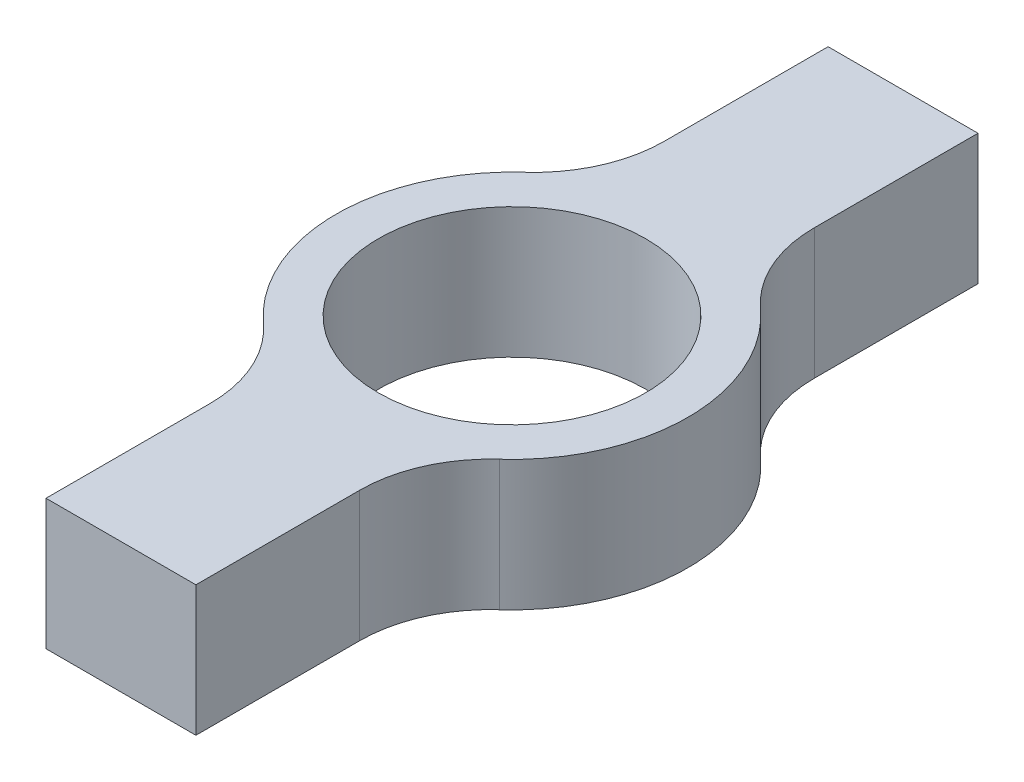
ISO-10303-21;
HEADER;
FILE_DESCRIPTION(('STEP AP214'),'2;1');
FILE_NAME('part.step','',(''),(''),'','','');
FILE_SCHEMA(('AUTOMOTIVE_DESIGN { 1 0 10303 214 1 1 1 1 }'));
ENDSEC;
DATA;
#1=APPLICATION_CONTEXT('core data for automotive mechanical design processes');
#2=APPLICATION_PROTOCOL_DEFINITION('international standard','automotive_design',2000,#1);
#3=PRODUCT_CONTEXT('',#1,'mechanical');
#4=PRODUCT('Part','Part','',(#3));
#5=PRODUCT_RELATED_PRODUCT_CATEGORY('part','',(#4));
#6=PRODUCT_DEFINITION_FORMATION('','',#4);
#7=PRODUCT_DEFINITION_CONTEXT('part definition',#1,'design');
#8=PRODUCT_DEFINITION('design','',#6,#7);
#9=PRODUCT_DEFINITION_SHAPE('','',#8);
#10=(LENGTH_UNIT() NAMED_UNIT(*) SI_UNIT(.MILLI.,.METRE.));
#11=(NAMED_UNIT(*) PLANE_ANGLE_UNIT() SI_UNIT($,.RADIAN.));
#12=(NAMED_UNIT(*) SI_UNIT($,.STERADIAN.) SOLID_ANGLE_UNIT());
#13=UNCERTAINTY_MEASURE_WITH_UNIT(LENGTH_MEASURE(1.E-05),#10,'distance_accuracy_value','');
#14=(GEOMETRIC_REPRESENTATION_CONTEXT(3) GLOBAL_UNCERTAINTY_ASSIGNED_CONTEXT((#13)) GLOBAL_UNIT_ASSIGNED_CONTEXT((#10,
#11,#12)) REPRESENTATION_CONTEXT('',''));
#15=CARTESIAN_POINT('',(0.,0.,0.));
#16=DIRECTION('',(0.,0.,1.));
#17=DIRECTION('',(1.,0.,0.));
#18=AXIS2_PLACEMENT_3D('',#15,#16,#17);
#19=CARTESIAN_POINT('',(0.,10.,0.));
#20=DIRECTION('',(0.,-1.,0.));
#21=DIRECTION('',(0.,0.,-1.));
#22=AXIS2_PLACEMENT_3D('',#19,#20,#21);
#23=CYLINDRICAL_SURFACE('',#22,13.5);
#24=CARTESIAN_POINT('',(0.,0.,0.));
#25=DIRECTION('',(0.,1.,0.));
#26=DIRECTION('',(0.,0.,1.));
#27=AXIS2_PLACEMENT_3D('',#24,#25,#26);
#28=CIRCLE('',#27,13.5);
#29=CARTESIAN_POINT('',(-9.04787234042553,0.,-10.0192817163389));
#30=VERTEX_POINT('',#29);
#31=CARTESIAN_POINT('',(-9.04787234042553,0.,10.0192817163389));
#32=VERTEX_POINT('',#31);
#33=EDGE_CURVE('E170',#30,#32,#28,.T.);
#34=ORIENTED_EDGE('',*,*,#33,.T.);
#35=DIRECTION('',(0.,-1.,0.));
#36=VECTOR('',#35,1.);
#37=CARTESIAN_POINT('',(-9.04787234042553,10.,10.0192817163389));
#38=LINE('',#37,#36);
#39=CARTESIAN_POINT('',(-9.04787234042553,10.,10.0192817163389));
#40=VERTEX_POINT('',#39);
#41=EDGE_CURVE('E195',#32,#40,#38,.F.);
#42=ORIENTED_EDGE('',*,*,#41,.T.);
#43=CARTESIAN_POINT('',(0.,10.,0.));
#44=DIRECTION('',(0.,1.,0.));
#45=DIRECTION('',(0.,0.,1.));
#46=AXIS2_PLACEMENT_3D('',#43,#44,#45);
#47=CIRCLE('',#46,13.5);
#48=CARTESIAN_POINT('',(-9.04787234042553,10.,-10.0192817163389));
#49=VERTEX_POINT('',#48);
#50=EDGE_CURVE('E175',#49,#40,#47,.T.);
#51=ORIENTED_EDGE('',*,*,#50,.F.);
#52=DIRECTION('',(0.,-1.,0.));
#53=VECTOR('',#52,1.);
#54=CARTESIAN_POINT('',(-9.04787234042553,10.,-10.0192817163389));
#55=LINE('',#54,#53);
#56=EDGE_CURVE('E192',#49,#30,#55,.T.);
#57=ORIENTED_EDGE('',*,*,#56,.T.);
#58=EDGE_LOOP('',(#34,#42,#51,#57));
#59=FACE_BOUND('',#58,.T.);
#60=ADVANCED_FACE('F35',(#59),#23,.T.);
#61=CARTESIAN_POINT('',(9.04787234042554,0.,10.0192817163389));
#62=VERTEX_POINT('',#61);
#63=CARTESIAN_POINT('',(9.04787234042553,0.,-10.0192817163389));
#64=VERTEX_POINT('',#63);
#65=EDGE_CURVE('E179',#62,#64,#28,.T.);
#66=ORIENTED_EDGE('',*,*,#65,.T.);
#67=DIRECTION('',(0.,-1.,0.));
#68=VECTOR('',#67,1.);
#69=CARTESIAN_POINT('',(9.04787234042553,10.,-10.0192817163389));
#70=LINE('',#69,#68);
#71=CARTESIAN_POINT('',(9.04787234042553,10.,-10.0192817163389));
#72=VERTEX_POINT('',#71);
#73=EDGE_CURVE('E185',#64,#72,#70,.F.);
#74=ORIENTED_EDGE('',*,*,#73,.T.);
#75=CARTESIAN_POINT('',(9.04787234042554,10.,10.0192817163389));
#76=VERTEX_POINT('',#75);
#77=EDGE_CURVE('E178',#76,#72,#47,.T.);
#78=ORIENTED_EDGE('',*,*,#77,.F.);
#79=DIRECTION('',(0.,-1.,0.));
#80=VECTOR('',#79,1.);
#81=CARTESIAN_POINT('',(9.04787234042554,10.,10.0192817163389));
#82=LINE('',#81,#80);
#83=EDGE_CURVE('E182',#76,#62,#82,.T.);
#84=ORIENTED_EDGE('',*,*,#83,.T.);
#85=EDGE_LOOP('',(#66,#74,#78,#84));
#86=FACE_BOUND('',#85,.T.);
#87=ADVANCED_FACE('F231',(#86),#23,.T.);
#88=CARTESIAN_POINT('',(0.,10.,0.));
#89=DIRECTION('',(0.,1.,0.));
#90=DIRECTION('',(0.,0.,1.));
#91=AXIS2_PLACEMENT_3D('',#88,#89,#90);
#92=PLANE('',#91);
#93=CARTESIAN_POINT('',(0.,10.,0.));
#94=DIRECTION('',(0.,1.,0.));
#95=DIRECTION('',(0.,0.,1.));
#96=AXIS2_PLACEMENT_3D('',#93,#94,#95);
#97=CIRCLE('',#96,10.25);
#98=CARTESIAN_POINT('',(0.,10.,10.25));
#99=VERTEX_POINT('',#98);
#100=EDGE_CURVE('E221',#99,#99,#97,.T.);
#101=ORIENTED_EDGE('',*,*,#100,.F.);
#102=EDGE_LOOP('',(#101));
#103=FACE_BOUND('',#102,.T.);
#104=DIRECTION('',(0.,0.,-1.));
#105=VECTOR('',#104,1.);
#106=CARTESIAN_POINT('',(5.75,10.,-30.));
#107=LINE('',#106,#105);
#108=CARTESIAN_POINT('',(5.75000000000001,10.,30.));
#109=VERTEX_POINT('',#108);
#110=CARTESIAN_POINT('',(5.75000000000001,10.,17.4409718765899));
#111=VERTEX_POINT('',#110);
#112=EDGE_CURVE('E163',#109,#111,#107,.T.);
#113=ORIENTED_EDGE('',*,*,#112,.T.);
#114=CARTESIAN_POINT('',(15.75,10.,17.4409718765899));
#115=DIRECTION('',(0.,1.,0.));
#116=DIRECTION('',(0.,0.,1.));
#117=AXIS2_PLACEMENT_3D('',#114,#115,#116);
#118=CIRCLE('',#117,10.);
#119=EDGE_CURVE('E206',#111,#76,#118,.F.);
#120=ORIENTED_EDGE('',*,*,#119,.T.);
#121=ORIENTED_EDGE('',*,*,#77,.T.);
#122=CARTESIAN_POINT('',(15.75,10.,-17.4409718765899));
#123=DIRECTION('',(0.,1.,0.));
#124=DIRECTION('',(0.,0.,1.));
#125=AXIS2_PLACEMENT_3D('',#122,#123,#124);
#126=CIRCLE('',#125,10.);
#127=CARTESIAN_POINT('',(5.75,10.,-17.4409718765899));
#128=VERTEX_POINT('',#127);
#129=EDGE_CURVE('E200',#72,#128,#126,.F.);
#130=ORIENTED_EDGE('',*,*,#129,.T.);
#131=CARTESIAN_POINT('',(5.75,10.,-30.));
#132=VERTEX_POINT('',#131);
#133=EDGE_CURVE('E162',#128,#132,#107,.T.);
#134=ORIENTED_EDGE('',*,*,#133,.T.);
#135=DIRECTION('',(-1.,0.,0.));
#136=VECTOR('',#135,1.);
#137=CARTESIAN_POINT('',(-5.75,10.,-30.));
#138=LINE('',#137,#136);
#139=CARTESIAN_POINT('',(-5.75,10.,-30.));
#140=VERTEX_POINT('',#139);
#141=EDGE_CURVE('E135',#132,#140,#138,.T.);
#142=ORIENTED_EDGE('',*,*,#141,.T.);
#143=DIRECTION('',(0.,0.,1.));
#144=VECTOR('',#143,1.);
#145=CARTESIAN_POINT('',(-5.75,10.,-30.));
#146=LINE('',#145,#144);
#147=CARTESIAN_POINT('',(-5.75,10.,-17.4409718765899));
#148=VERTEX_POINT('',#147);
#149=EDGE_CURVE('E158',#140,#148,#146,.T.);
#150=ORIENTED_EDGE('',*,*,#149,.T.);
#151=CARTESIAN_POINT('',(-15.75,10.,-17.4409718765899));
#152=DIRECTION('',(0.,1.,0.));
#153=DIRECTION('',(0.,0.,1.));
#154=AXIS2_PLACEMENT_3D('',#151,#152,#153);
#155=CIRCLE('',#154,10.);
#156=EDGE_CURVE('E11',#148,#49,#155,.F.);
#157=ORIENTED_EDGE('',*,*,#156,.T.);
#158=ORIENTED_EDGE('',*,*,#50,.T.);
#159=CARTESIAN_POINT('',(-15.75,10.,17.4409718765899));
#160=DIRECTION('',(0.,1.,0.));
#161=DIRECTION('',(0.,0.,1.));
#162=AXIS2_PLACEMENT_3D('',#159,#160,#161);
#163=CIRCLE('',#162,10.);
#164=CARTESIAN_POINT('',(-5.74999999999999,10.,17.4409718765899));
#165=VERTEX_POINT('',#164);
#166=EDGE_CURVE('E208',#40,#165,#163,.F.);
#167=ORIENTED_EDGE('',*,*,#166,.T.);
#168=CARTESIAN_POINT('',(-5.74999999999999,10.,30.));
#169=VERTEX_POINT('',#168);
#170=EDGE_CURVE('E160',#165,#169,#146,.T.);
#171=ORIENTED_EDGE('',*,*,#170,.T.);
#172=DIRECTION('',(1.,0.,0.));
#173=VECTOR('',#172,1.);
#174=CARTESIAN_POINT('',(-5.74999999999999,10.,30.));
#175=LINE('',#174,#173);
#176=EDGE_CURVE('E142',#169,#109,#175,.T.);
#177=ORIENTED_EDGE('',*,*,#176,.T.);
#178=EDGE_LOOP('',(#113,#120,#121,#130,#134,#142,#150,#157,#158,#167,#171,#177));
#179=FACE_BOUND('',#178,.T.);
#180=ADVANCED_FACE('F218',(#103,#179),#92,.T.);
#181=CARTESIAN_POINT('',(0.,0.,0.));
#182=DIRECTION('',(0.,1.,0.));
#183=DIRECTION('',(0.,0.,1.));
#184=AXIS2_PLACEMENT_3D('',#181,#182,#183);
#185=PLANE('',#184);
#186=CARTESIAN_POINT('',(0.,0.,0.));
#187=DIRECTION('',(0.,1.,0.));
#188=DIRECTION('',(0.,0.,1.));
#189=AXIS2_PLACEMENT_3D('',#186,#187,#188);
#190=CIRCLE('',#189,10.25);
#191=CARTESIAN_POINT('',(0.,0.,10.25));
#192=VERTEX_POINT('',#191);
#193=EDGE_CURVE('E219',#192,#192,#190,.T.);
#194=ORIENTED_EDGE('',*,*,#193,.T.);
#195=EDGE_LOOP('',(#194));
#196=FACE_BOUND('',#195,.T.);
#197=ORIENTED_EDGE('',*,*,#65,.F.);
#198=CARTESIAN_POINT('',(15.75,0.,17.4409718765899));
#199=DIRECTION('',(0.,1.,0.));
#200=DIRECTION('',(0.,0.,1.));
#201=AXIS2_PLACEMENT_3D('',#198,#199,#200);
#202=CIRCLE('',#201,10.);
#203=CARTESIAN_POINT('',(5.75000000000001,0.,17.4409718765899));
#204=VERTEX_POINT('',#203);
#205=EDGE_CURVE('E204',#62,#204,#202,.T.);
#206=ORIENTED_EDGE('',*,*,#205,.T.);
#207=DIRECTION('',(0.,0.,-1.));
#208=VECTOR('',#207,1.);
#209=CARTESIAN_POINT('',(5.75,0.,-30.));
#210=LINE('',#209,#208);
#211=CARTESIAN_POINT('',(5.75000000000001,0.,30.));
#212=VERTEX_POINT('',#211);
#213=EDGE_CURVE('E150',#212,#204,#210,.T.);
#214=ORIENTED_EDGE('',*,*,#213,.F.);
#215=DIRECTION('',(1.,0.,0.));
#216=VECTOR('',#215,1.);
#217=CARTESIAN_POINT('',(-5.74999999999999,0.,30.));
#218=LINE('',#217,#216);
#219=CARTESIAN_POINT('',(-5.74999999999999,0.,30.));
#220=VERTEX_POINT('',#219);
#221=EDGE_CURVE('E140',#220,#212,#218,.T.);
#222=ORIENTED_EDGE('',*,*,#221,.F.);
#223=DIRECTION('',(0.,0.,1.));
#224=VECTOR('',#223,1.);
#225=CARTESIAN_POINT('',(-5.75,0.,-30.));
#226=LINE('',#225,#224);
#227=CARTESIAN_POINT('',(-5.74999999999999,0.,17.4409718765899));
#228=VERTEX_POINT('',#227);
#229=EDGE_CURVE('E124',#228,#220,#226,.T.);
#230=ORIENTED_EDGE('',*,*,#229,.F.);
#231=CARTESIAN_POINT('',(-15.75,0.,17.4409718765899));
#232=DIRECTION('',(0.,1.,0.));
#233=DIRECTION('',(0.,0.,1.));
#234=AXIS2_PLACEMENT_3D('',#231,#232,#233);
#235=CIRCLE('',#234,10.);
#236=EDGE_CURVE('E210',#228,#32,#235,.T.);
#237=ORIENTED_EDGE('',*,*,#236,.T.);
#238=ORIENTED_EDGE('',*,*,#33,.F.);
#239=CARTESIAN_POINT('',(-15.75,0.,-17.4409718765899));
#240=DIRECTION('',(0.,1.,0.));
#241=DIRECTION('',(0.,0.,1.));
#242=AXIS2_PLACEMENT_3D('',#239,#240,#241);
#243=CIRCLE('',#242,10.);
#244=CARTESIAN_POINT('',(-5.75,0.,-17.4409718765899));
#245=VERTEX_POINT('',#244);
#246=EDGE_CURVE('E43',#30,#245,#243,.T.);
#247=ORIENTED_EDGE('',*,*,#246,.T.);
#248=CARTESIAN_POINT('',(-5.75,0.,-30.));
#249=VERTEX_POINT('',#248);
#250=EDGE_CURVE('E134',#249,#245,#226,.T.);
#251=ORIENTED_EDGE('',*,*,#250,.F.);
#252=DIRECTION('',(-1.,0.,0.));
#253=VECTOR('',#252,1.);
#254=CARTESIAN_POINT('',(-5.75,0.,-30.));
#255=LINE('',#254,#253);
#256=CARTESIAN_POINT('',(5.75,0.,-30.));
#257=VERTEX_POINT('',#256);
#258=EDGE_CURVE('E144',#257,#249,#255,.T.);
#259=ORIENTED_EDGE('',*,*,#258,.F.);
#260=CARTESIAN_POINT('',(5.75,0.,-17.4409718765899));
#261=VERTEX_POINT('',#260);
#262=EDGE_CURVE('E151',#261,#257,#210,.T.);
#263=ORIENTED_EDGE('',*,*,#262,.F.);
#264=CARTESIAN_POINT('',(15.75,0.,-17.4409718765899));
#265=DIRECTION('',(0.,1.,0.));
#266=DIRECTION('',(0.,0.,1.));
#267=AXIS2_PLACEMENT_3D('',#264,#265,#266);
#268=CIRCLE('',#267,10.);
#269=EDGE_CURVE('E202',#261,#64,#268,.T.);
#270=ORIENTED_EDGE('',*,*,#269,.T.);
#271=EDGE_LOOP('',(#197,#206,#214,#222,#230,#237,#238,#247,#251,#259,#263,#270));
#272=FACE_BOUND('',#271,.T.);
#273=ADVANCED_FACE('F148',(#196,#272),#185,.F.);
#274=CARTESIAN_POINT('',(-5.74999999999999,0.,30.));
#275=DIRECTION('',(0.,0.,1.));
#276=DIRECTION('',(1.,0.,0.));
#277=AXIS2_PLACEMENT_3D('',#274,#275,#276);
#278=PLANE('',#277);
#279=ORIENTED_EDGE('',*,*,#176,.F.);
#280=DIRECTION('',(0.,1.,0.));
#281=VECTOR('',#280,1.);
#282=CARTESIAN_POINT('',(-5.74999999999999,0.,30.));
#283=LINE('',#282,#281);
#284=EDGE_CURVE('E128',#220,#169,#283,.T.);
#285=ORIENTED_EDGE('',*,*,#284,.F.);
#286=ORIENTED_EDGE('',*,*,#221,.T.);
#287=DIRECTION('',(0.,1.,0.));
#288=VECTOR('',#287,1.);
#289=CARTESIAN_POINT('',(5.75000000000001,0.,30.));
#290=LINE('',#289,#288);
#291=EDGE_CURVE('E143',#212,#109,#290,.T.);
#292=ORIENTED_EDGE('',*,*,#291,.T.);
#293=EDGE_LOOP('',(#279,#285,#286,#292));
#294=FACE_BOUND('',#293,.T.);
#295=ADVANCED_FACE('F139',(#294),#278,.T.);
#296=CARTESIAN_POINT('',(5.75,0.,-30.));
#297=DIRECTION('',(1.,0.,0.));
#298=DIRECTION('',(0.,0.,-1.));
#299=AXIS2_PLACEMENT_3D('',#296,#297,#298);
#300=PLANE('',#299);
#301=ORIENTED_EDGE('',*,*,#213,.T.);
#302=DIRECTION('',(0.,-1.,0.));
#303=VECTOR('',#302,1.);
#304=CARTESIAN_POINT('',(5.75000000000001,0.,17.4409718765899));
#305=LINE('',#304,#303);
#306=EDGE_CURVE('E190',#204,#111,#305,.F.);
#307=ORIENTED_EDGE('',*,*,#306,.T.);
#308=ORIENTED_EDGE('',*,*,#112,.F.);
#309=ORIENTED_EDGE('',*,*,#291,.F.);
#310=EDGE_LOOP('',(#301,#307,#308,#309));
#311=FACE_BOUND('',#310,.T.);
#312=ADVANCED_FACE('F282',(#311),#300,.T.);
#313=CARTESIAN_POINT('',(-5.75,0.,-30.));
#314=DIRECTION('',(-1.,0.,0.));
#315=DIRECTION('',(0.,0.,1.));
#316=AXIS2_PLACEMENT_3D('',#313,#314,#315);
#317=PLANE('',#316);
#318=ORIENTED_EDGE('',*,*,#170,.F.);
#319=DIRECTION('',(0.,-1.,0.));
#320=VECTOR('',#319,1.);
#321=CARTESIAN_POINT('',(-5.74999999999999,0.,17.4409718765899));
#322=LINE('',#321,#320);
#323=EDGE_CURVE('E131',#165,#228,#322,.T.);
#324=ORIENTED_EDGE('',*,*,#323,.T.);
#325=ORIENTED_EDGE('',*,*,#229,.T.);
#326=ORIENTED_EDGE('',*,*,#284,.T.);
#327=EDGE_LOOP('',(#318,#324,#325,#326));
#328=FACE_BOUND('',#327,.T.);
#329=ADVANCED_FACE('F127',(#328),#317,.T.);
#330=ORIENTED_EDGE('',*,*,#250,.T.);
#331=DIRECTION('',(0.,-1.,0.));
#332=VECTOR('',#331,1.);
#333=CARTESIAN_POINT('',(-5.75,0.,-17.4409718765899));
#334=LINE('',#333,#332);
#335=EDGE_CURVE('E56',#245,#148,#334,.F.);
#336=ORIENTED_EDGE('',*,*,#335,.T.);
#337=ORIENTED_EDGE('',*,*,#149,.F.);
#338=DIRECTION('',(0.,1.,0.));
#339=VECTOR('',#338,1.);
#340=CARTESIAN_POINT('',(-5.75,0.,-30.));
#341=LINE('',#340,#339);
#342=EDGE_CURVE('E168',#249,#140,#341,.T.);
#343=ORIENTED_EDGE('',*,*,#342,.F.);
#344=EDGE_LOOP('',(#330,#336,#337,#343));
#345=FACE_BOUND('',#344,.T.);
#346=ADVANCED_FACE('F262',(#345),#317,.T.);
#347=ORIENTED_EDGE('',*,*,#133,.F.);
#348=DIRECTION('',(0.,-1.,0.));
#349=VECTOR('',#348,1.);
#350=CARTESIAN_POINT('',(5.75,0.,-17.4409718765899));
#351=LINE('',#350,#349);
#352=EDGE_CURVE('E188',#128,#261,#351,.T.);
#353=ORIENTED_EDGE('',*,*,#352,.T.);
#354=ORIENTED_EDGE('',*,*,#262,.T.);
#355=DIRECTION('',(0.,1.,0.));
#356=VECTOR('',#355,1.);
#357=CARTESIAN_POINT('',(5.75,0.,-30.));
#358=LINE('',#357,#356);
#359=EDGE_CURVE('E171',#257,#132,#358,.T.);
#360=ORIENTED_EDGE('',*,*,#359,.T.);
#361=EDGE_LOOP('',(#347,#353,#354,#360));
#362=FACE_BOUND('',#361,.T.);
#363=ADVANCED_FACE('F270',(#362),#300,.T.);
#364=CARTESIAN_POINT('',(-5.75,0.,-30.));
#365=DIRECTION('',(0.,0.,-1.));
#366=DIRECTION('',(-1.,0.,0.));
#367=AXIS2_PLACEMENT_3D('',#364,#365,#366);
#368=PLANE('',#367);
#369=ORIENTED_EDGE('',*,*,#141,.F.);
#370=ORIENTED_EDGE('',*,*,#359,.F.);
#371=ORIENTED_EDGE('',*,*,#258,.T.);
#372=ORIENTED_EDGE('',*,*,#342,.T.);
#373=EDGE_LOOP('',(#369,#370,#371,#372));
#374=FACE_BOUND('',#373,.T.);
#375=ADVANCED_FACE('F267',(#374),#368,.T.);
#376=CARTESIAN_POINT('',(0.,0.,0.));
#377=DIRECTION('',(0.,1.,0.));
#378=DIRECTION('',(0.,0.,1.));
#379=AXIS2_PLACEMENT_3D('',#376,#377,#378);
#380=CYLINDRICAL_SURFACE('',#379,10.25);
#381=ORIENTED_EDGE('',*,*,#193,.F.);
#382=EDGE_LOOP('',(#381));
#383=FACE_BOUND('',#382,.T.);
#384=ORIENTED_EDGE('',*,*,#100,.T.);
#385=EDGE_LOOP('',(#384));
#386=FACE_BOUND('',#385,.T.);
#387=ADVANCED_FACE('F228',(#383,#386),#380,.F.);
#388=CARTESIAN_POINT('',(15.75,10.,-17.4409718765899));
#389=DIRECTION('',(0.,-1.,0.));
#390=DIRECTION('',(0.,0.,-1.));
#391=AXIS2_PLACEMENT_3D('',#388,#389,#390);
#392=CYLINDRICAL_SURFACE('',#391,10.);
#393=ORIENTED_EDGE('',*,*,#269,.F.);
#394=ORIENTED_EDGE('',*,*,#352,.F.);
#395=ORIENTED_EDGE('',*,*,#129,.F.);
#396=ORIENTED_EDGE('',*,*,#73,.F.);
#397=EDGE_LOOP('',(#393,#394,#395,#396));
#398=FACE_BOUND('',#397,.T.);
#399=ADVANCED_FACE('F246',(#398),#392,.F.);
#400=CARTESIAN_POINT('',(15.75,10.,17.4409718765899));
#401=DIRECTION('',(0.,-1.,0.));
#402=DIRECTION('',(0.,0.,-1.));
#403=AXIS2_PLACEMENT_3D('',#400,#401,#402);
#404=CYLINDRICAL_SURFACE('',#403,10.);
#405=ORIENTED_EDGE('',*,*,#119,.F.);
#406=ORIENTED_EDGE('',*,*,#306,.F.);
#407=ORIENTED_EDGE('',*,*,#205,.F.);
#408=ORIENTED_EDGE('',*,*,#83,.F.);
#409=EDGE_LOOP('',(#405,#406,#407,#408));
#410=FACE_BOUND('',#409,.T.);
#411=ADVANCED_FACE('F249',(#410),#404,.F.);
#412=CARTESIAN_POINT('',(-15.75,10.,17.4409718765899));
#413=DIRECTION('',(0.,-1.,0.));
#414=DIRECTION('',(0.,0.,-1.));
#415=AXIS2_PLACEMENT_3D('',#412,#413,#414);
#416=CYLINDRICAL_SURFACE('',#415,10.);
#417=ORIENTED_EDGE('',*,*,#236,.F.);
#418=ORIENTED_EDGE('',*,*,#323,.F.);
#419=ORIENTED_EDGE('',*,*,#166,.F.);
#420=ORIENTED_EDGE('',*,*,#41,.F.);
#421=EDGE_LOOP('',(#417,#418,#419,#420));
#422=FACE_BOUND('',#421,.T.);
#423=ADVANCED_FACE('F216',(#422),#416,.F.);
#424=CARTESIAN_POINT('',(-15.75,10.,-17.4409718765899));
#425=DIRECTION('',(0.,-1.,0.));
#426=DIRECTION('',(0.,0.,-1.));
#427=AXIS2_PLACEMENT_3D('',#424,#425,#426);
#428=CYLINDRICAL_SURFACE('',#427,10.);
#429=ORIENTED_EDGE('',*,*,#156,.F.);
#430=ORIENTED_EDGE('',*,*,#335,.F.);
#431=ORIENTED_EDGE('',*,*,#246,.F.);
#432=ORIENTED_EDGE('',*,*,#56,.F.);
#433=EDGE_LOOP('',(#429,#430,#431,#432));
#434=FACE_BOUND('',#433,.T.);
#435=ADVANCED_FACE('F37',(#434),#428,.F.);
#436=CLOSED_SHELL('',(#60,#87,#180,#273,#295,#312,#329,#346,#363,#375,#387,#399,#411,#423,#435));
#437=MANIFOLD_SOLID_BREP('B2',#436);
#438=ADVANCED_BREP_SHAPE_REPRESENTATION('',(#18,#437),#14);
#439=SHAPE_DEFINITION_REPRESENTATION(#9,#438);
ENDSEC;
END-ISO-10303-21;
